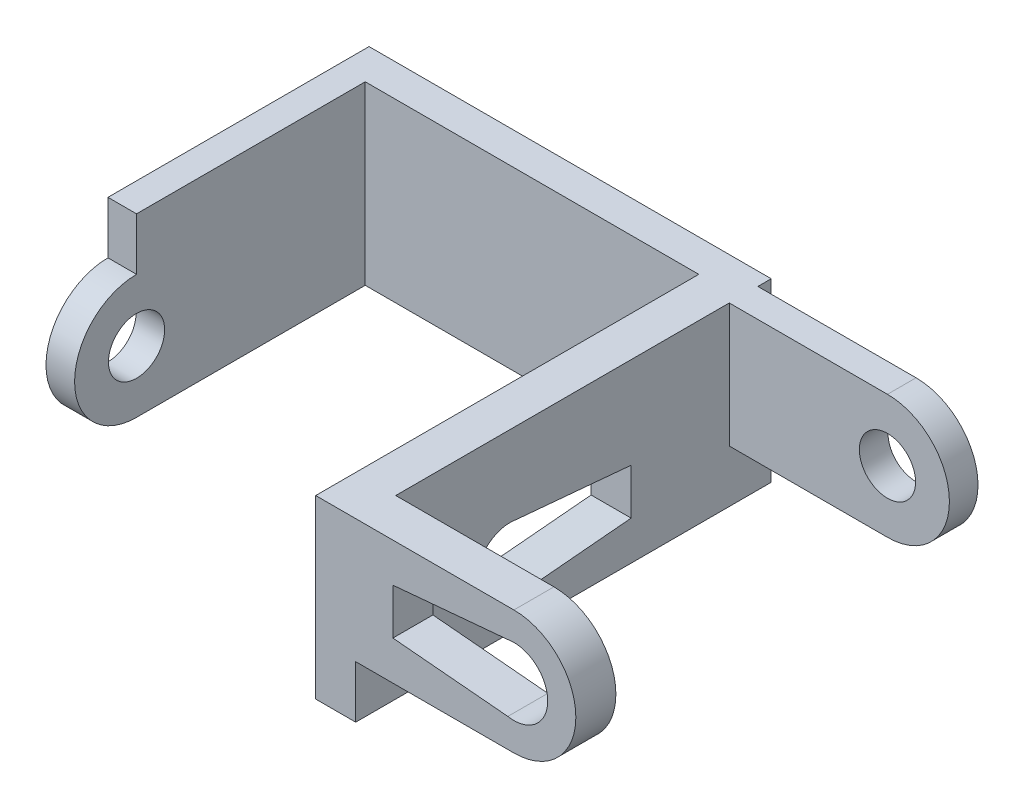
ISO-10303-21;
HEADER;
FILE_DESCRIPTION(('STEP AP214'),'2;1');
FILE_NAME('part.step','',(''),(''),'','','');
FILE_SCHEMA(('AUTOMOTIVE_DESIGN { 1 0 10303 214 1 1 1 1 }'));
ENDSEC;
DATA;
#1=APPLICATION_CONTEXT('core data for automotive mechanical design processes');
#2=APPLICATION_PROTOCOL_DEFINITION('international standard','automotive_design',2000,#1);
#3=PRODUCT_CONTEXT('',#1,'mechanical');
#4=PRODUCT('Part','Part','',(#3));
#5=PRODUCT_RELATED_PRODUCT_CATEGORY('part','',(#4));
#6=PRODUCT_DEFINITION_FORMATION('','',#4);
#7=PRODUCT_DEFINITION_CONTEXT('part definition',#1,'design');
#8=PRODUCT_DEFINITION('design','',#6,#7);
#9=PRODUCT_DEFINITION_SHAPE('','',#8);
#10=(LENGTH_UNIT() NAMED_UNIT(*) SI_UNIT(.MILLI.,.METRE.));
#11=(NAMED_UNIT(*) PLANE_ANGLE_UNIT() SI_UNIT($,.RADIAN.));
#12=(NAMED_UNIT(*) SI_UNIT($,.STERADIAN.) SOLID_ANGLE_UNIT());
#13=UNCERTAINTY_MEASURE_WITH_UNIT(LENGTH_MEASURE(1.E-05),#10,'distance_accuracy_value','');
#14=(GEOMETRIC_REPRESENTATION_CONTEXT(3) GLOBAL_UNCERTAINTY_ASSIGNED_CONTEXT((#13)) GLOBAL_UNIT_ASSIGNED_CONTEXT((#10,
#11,#12)) REPRESENTATION_CONTEXT('',''));
#15=CARTESIAN_POINT('',(0.,0.,0.));
#16=DIRECTION('',(0.,0.,1.));
#17=DIRECTION('',(1.,0.,0.));
#18=AXIS2_PLACEMENT_3D('',#15,#16,#17);
#19=CARTESIAN_POINT('',(-72.,-30.5,0.));
#20=DIRECTION('',(0.,0.,-1.));
#21=DIRECTION('',(-1.,0.,0.));
#22=AXIS2_PLACEMENT_3D('',#19,#20,#21);
#23=PLANE('',#22);
#24=DIRECTION('',(-1.,0.,0.));
#25=VECTOR('',#24,1.);
#26=CARTESIAN_POINT('',(-72.,-17.5,0.));
#27=LINE('',#26,#25);
#28=CARTESIAN_POINT('',(-72.,-17.5,0.));
#29=VERTEX_POINT('',#28);
#30=CARTESIAN_POINT('',(-75.,-17.5,0.));
#31=VERTEX_POINT('',#30);
#32=EDGE_CURVE('E11',#29,#31,#27,.T.);
#33=ORIENTED_EDGE('',*,*,#32,.F.);
#34=DIRECTION('',(0.,-1.,0.));
#35=VECTOR('',#34,1.);
#36=CARTESIAN_POINT('',(-72.,-30.5,0.));
#37=LINE('',#36,#35);
#38=CARTESIAN_POINT('',(-72.,-12.,0.));
#39=VERTEX_POINT('',#38);
#40=EDGE_CURVE('E239',#39,#29,#37,.T.);
#41=ORIENTED_EDGE('',*,*,#40,.F.);
#42=DIRECTION('',(-1.,0.,0.));
#43=VECTOR('',#42,1.);
#44=CARTESIAN_POINT('',(-72.,-12.,0.));
#45=LINE('',#44,#43);
#46=CARTESIAN_POINT('',(-75.,-12.,0.));
#47=VERTEX_POINT('',#46);
#48=EDGE_CURVE('E214',#39,#47,#45,.T.);
#49=ORIENTED_EDGE('',*,*,#48,.T.);
#50=DIRECTION('',(0.,-1.,0.));
#51=VECTOR('',#50,1.);
#52=CARTESIAN_POINT('',(-75.,-30.5,0.));
#53=LINE('',#52,#51);
#54=EDGE_CURVE('E58',#47,#31,#53,.T.);
#55=ORIENTED_EDGE('',*,*,#54,.T.);
#56=EDGE_LOOP('',(#33,#41,#49,#55));
#57=FACE_BOUND('',#56,.T.);
#58=ADVANCED_FACE('F39',(#57),#23,.F.);
#59=CARTESIAN_POINT('',(0.,0.,-24.));
#60=DIRECTION('',(0.,0.,-1.));
#61=DIRECTION('',(-1.,0.,0.));
#62=AXIS2_PLACEMENT_3D('',#59,#60,#61);
#63=PLANE('',#62);
#64=DIRECTION('',(0.,1.,0.));
#65=VECTOR('',#64,1.);
#66=CARTESIAN_POINT('',(-72.,0.,-24.));
#67=LINE('',#66,#65);
#68=CARTESIAN_POINT('',(-72.,-30.5,-24.));
#69=VERTEX_POINT('',#68);
#70=CARTESIAN_POINT('',(-72.,-12.,-24.));
#71=VERTEX_POINT('',#70);
#72=EDGE_CURVE('E48',#69,#71,#67,.T.);
#73=ORIENTED_EDGE('',*,*,#72,.F.);
#74=DIRECTION('',(1.,0.,0.));
#75=VECTOR('',#74,1.);
#76=CARTESIAN_POINT('',(-75.,-30.5,-24.));
#77=LINE('',#76,#75);
#78=CARTESIAN_POINT('',(-37.,-30.5,-24.));
#79=VERTEX_POINT('',#78);
#80=EDGE_CURVE('E251',#69,#79,#77,.T.);
#81=ORIENTED_EDGE('',*,*,#80,.T.);
#82=DIRECTION('',(0.,-1.,0.));
#83=VECTOR('',#82,1.);
#84=CARTESIAN_POINT('',(-37.,0.,-24.));
#85=LINE('',#84,#83);
#86=CARTESIAN_POINT('',(-37.,-12.,-24.));
#87=VERTEX_POINT('',#86);
#88=EDGE_CURVE('E468',#87,#79,#85,.T.);
#89=ORIENTED_EDGE('',*,*,#88,.F.);
#90=DIRECTION('',(-1.,0.,0.));
#91=VECTOR('',#90,1.);
#92=CARTESIAN_POINT('',(-75.,-12.,-24.));
#93=LINE('',#92,#91);
#94=EDGE_CURVE('E254',#87,#71,#93,.T.);
#95=ORIENTED_EDGE('',*,*,#94,.T.);
#96=EDGE_LOOP('',(#73,#81,#89,#95));
#97=FACE_BOUND('',#96,.T.);
#98=ADVANCED_FACE('F483',(#97),#63,.F.);
#99=CARTESIAN_POINT('',(-37.,0.,0.));
#100=DIRECTION('',(-1.,0.,0.));
#101=DIRECTION('',(0.,0.,1.));
#102=AXIS2_PLACEMENT_3D('',#99,#100,#101);
#103=PLANE('',#102);
#104=DIRECTION('',(0.,0.0899269689956985,0.995948362239352));
#105=VECTOR('',#104,1.);
#106=CARTESIAN_POINT('',(-37.,-20.45,0.));
#107=LINE('',#106,#105);
#108=CARTESIAN_POINT('',(-37.,-21.5967185946041,-12.7));
#109=VERTEX_POINT('',#108);
#110=CARTESIAN_POINT('',(-37.,-20.5074167042445,-0.635894584196137));
#111=VERTEX_POINT('',#110);
#112=EDGE_CURVE('E389',#109,#111,#107,.T.);
#113=ORIENTED_EDGE('',*,*,#112,.T.);
#114=CARTESIAN_POINT('',(-37.,-24.,0.));
#115=DIRECTION('',(1.,0.,0.));
#116=DIRECTION('',(0.,0.,-1.));
#117=AXIS2_PLACEMENT_3D('',#114,#115,#116);
#118=CIRCLE('',#117,3.55);
#119=CARTESIAN_POINT('',(-37.,-27.4925832957555,-0.635894584196137));
#120=VERTEX_POINT('',#119);
#121=EDGE_CURVE('E409',#111,#120,#118,.T.);
#122=ORIENTED_EDGE('',*,*,#121,.T.);
#123=DIRECTION('',(0.,0.0899269689956985,-0.995948362239352));
#124=VECTOR('',#123,1.);
#125=CARTESIAN_POINT('',(-37.,-26.4032814053959,-12.7));
#126=LINE('',#125,#124);
#127=CARTESIAN_POINT('',(-37.,-26.4032814053959,-12.7));
#128=VERTEX_POINT('',#127);
#129=EDGE_CURVE('E380',#120,#128,#126,.T.);
#130=ORIENTED_EDGE('',*,*,#129,.T.);
#131=DIRECTION('',(0.,1.,0.));
#132=VECTOR('',#131,1.);
#133=CARTESIAN_POINT('',(-37.,-21.5967185946041,-12.7));
#134=LINE('',#133,#132);
#135=EDGE_CURVE('E384',#128,#109,#134,.T.);
#136=ORIENTED_EDGE('',*,*,#135,.T.);
#137=EDGE_LOOP('',(#113,#122,#130,#136));
#138=FACE_BOUND('',#137,.T.);
#139=DIRECTION('',(0.,0.,1.));
#140=VECTOR('',#139,1.);
#141=CARTESIAN_POINT('',(-37.,-12.,16.2));
#142=LINE('',#141,#140);
#143=CARTESIAN_POINT('',(-37.,-12.,16.2));
#144=VERTEX_POINT('',#143);
#145=EDGE_CURVE('E419',#87,#144,#142,.T.);
#146=ORIENTED_EDGE('',*,*,#145,.F.);
#147=ORIENTED_EDGE('',*,*,#88,.T.);
#148=DIRECTION('',(0.,0.,-1.));
#149=VECTOR('',#148,1.);
#150=CARTESIAN_POINT('',(-37.,-30.5,16.2));
#151=LINE('',#150,#149);
#152=CARTESIAN_POINT('',(-37.,-30.5,16.2));
#153=VERTEX_POINT('',#152);
#154=EDGE_CURVE('E433',#153,#79,#151,.T.);
#155=ORIENTED_EDGE('',*,*,#154,.F.);
#156=DIRECTION('',(0.,-1.,0.));
#157=VECTOR('',#156,1.);
#158=CARTESIAN_POINT('',(-37.,-30.5,16.2));
#159=LINE('',#158,#157);
#160=EDGE_CURVE('E412',#144,#153,#159,.T.);
#161=ORIENTED_EDGE('',*,*,#160,.F.);
#162=EDGE_LOOP('',(#146,#147,#155,#161));
#163=FACE_BOUND('',#162,.T.);
#164=ADVANCED_FACE('F488',(#138,#163),#103,.T.);
#165=CARTESIAN_POINT('',(-32.8,0.,0.));
#166=DIRECTION('',(-1.,0.,0.));
#167=DIRECTION('',(0.,0.,1.));
#168=AXIS2_PLACEMENT_3D('',#165,#166,#167);
#169=PLANE('',#168);
#170=DIRECTION('',(0.,-1.,0.));
#171=VECTOR('',#170,1.);
#172=CARTESIAN_POINT('',(-32.8,0.,-26.));
#173=LINE('',#172,#171);
#174=CARTESIAN_POINT('',(-32.8,-12.,-26.));
#175=VERTEX_POINT('',#174);
#176=CARTESIAN_POINT('',(-32.8,-25.,-26.));
#177=VERTEX_POINT('',#176);
#178=EDGE_CURVE('E297',#175,#177,#173,.T.);
#179=ORIENTED_EDGE('',*,*,#178,.T.);
#180=DIRECTION('',(0.,0.,-1.));
#181=VECTOR('',#180,1.);
#182=CARTESIAN_POINT('',(-32.8,-25.,0.));
#183=LINE('',#182,#181);
#184=CARTESIAN_POINT('',(-32.8,-25.,-23.));
#185=VERTEX_POINT('',#184);
#186=EDGE_CURVE('E304',#185,#177,#183,.T.);
#187=ORIENTED_EDGE('',*,*,#186,.F.);
#188=DIRECTION('',(0.,-1.,0.));
#189=VECTOR('',#188,1.);
#190=CARTESIAN_POINT('',(-32.8,0.,-23.));
#191=LINE('',#190,#189);
#192=CARTESIAN_POINT('',(-32.8,-12.,-23.));
#193=VERTEX_POINT('',#192);
#194=EDGE_CURVE('E301',#193,#185,#191,.T.);
#195=ORIENTED_EDGE('',*,*,#194,.F.);
#196=DIRECTION('',(0.,0.,1.));
#197=VECTOR('',#196,1.);
#198=CARTESIAN_POINT('',(-32.8,-12.,16.2));
#199=LINE('',#198,#197);
#200=CARTESIAN_POINT('',(-32.8,-12.,12.));
#201=VERTEX_POINT('',#200);
#202=EDGE_CURVE('E425',#193,#201,#199,.T.);
#203=ORIENTED_EDGE('',*,*,#202,.T.);
#204=DIRECTION('',(0.,-1.,0.));
#205=VECTOR('',#204,1.);
#206=CARTESIAN_POINT('',(-32.8,0.,12.));
#207=LINE('',#206,#205);
#208=CARTESIAN_POINT('',(-32.8,-25.,12.));
#209=VERTEX_POINT('',#208);
#210=EDGE_CURVE('E371',#201,#209,#207,.T.);
#211=ORIENTED_EDGE('',*,*,#210,.T.);
#212=DIRECTION('',(0.,0.,-1.));
#213=VECTOR('',#212,1.);
#214=CARTESIAN_POINT('',(-32.8,-25.,0.));
#215=LINE('',#214,#213);
#216=CARTESIAN_POINT('',(-32.8,-25.,16.2));
#217=VERTEX_POINT('',#216);
#218=EDGE_CURVE('E375',#217,#209,#215,.T.);
#219=ORIENTED_EDGE('',*,*,#218,.F.);
#220=DIRECTION('',(0.,-1.,0.));
#221=VECTOR('',#220,1.);
#222=CARTESIAN_POINT('',(-32.8,-30.5,16.2));
#223=LINE('',#222,#221);
#224=CARTESIAN_POINT('',(-32.8,-30.5,16.2));
#225=VERTEX_POINT('',#224);
#226=EDGE_CURVE('E415',#217,#225,#223,.T.);
#227=ORIENTED_EDGE('',*,*,#226,.T.);
#228=DIRECTION('',(0.,0.,-1.));
#229=VECTOR('',#228,1.);
#230=CARTESIAN_POINT('',(-32.8,-30.5,16.2));
#231=LINE('',#230,#229);
#232=CARTESIAN_POINT('',(-32.8,-30.5,-27.4));
#233=VERTEX_POINT('',#232);
#234=EDGE_CURVE('E418',#225,#233,#231,.T.);
#235=ORIENTED_EDGE('',*,*,#234,.T.);
#236=DIRECTION('',(0.,1.,0.));
#237=VECTOR('',#236,1.);
#238=CARTESIAN_POINT('',(-32.8,-30.5,-27.4));
#239=LINE('',#238,#237);
#240=CARTESIAN_POINT('',(-32.8,-12.,-27.4));
#241=VERTEX_POINT('',#240);
#242=EDGE_CURVE('E422',#233,#241,#239,.T.);
#243=ORIENTED_EDGE('',*,*,#242,.T.);
#244=EDGE_CURVE('E426',#241,#175,#199,.T.);
#245=ORIENTED_EDGE('',*,*,#244,.T.);
#246=EDGE_LOOP('',(#179,#187,#195,#203,#211,#219,#227,#235,#243,#245));
#247=FACE_BOUND('',#246,.T.);
#248=CARTESIAN_POINT('',(-32.8,-24.,0.));
#249=DIRECTION('',(1.,0.,0.));
#250=DIRECTION('',(0.,0.,-1.));
#251=AXIS2_PLACEMENT_3D('',#248,#249,#250);
#252=CIRCLE('',#251,3.55);
#253=CARTESIAN_POINT('',(-32.8,-20.5074167042445,-0.635894584196137));
#254=VERTEX_POINT('',#253);
#255=CARTESIAN_POINT('',(-32.8,-27.4925832957555,-0.635894584196137));
#256=VERTEX_POINT('',#255);
#257=EDGE_CURVE('E405',#254,#256,#252,.T.);
#258=ORIENTED_EDGE('',*,*,#257,.F.);
#259=DIRECTION('',(0.,0.0899269689956985,0.995948362239352));
#260=VECTOR('',#259,1.);
#261=CARTESIAN_POINT('',(-32.8,-20.45,0.));
#262=LINE('',#261,#260);
#263=CARTESIAN_POINT('',(-32.8,-21.5967185946041,-12.7));
#264=VERTEX_POINT('',#263);
#265=EDGE_CURVE('E385',#264,#254,#262,.T.);
#266=ORIENTED_EDGE('',*,*,#265,.F.);
#267=DIRECTION('',(0.,1.,0.));
#268=VECTOR('',#267,1.);
#269=CARTESIAN_POINT('',(-32.8,-21.5967185946041,-12.7));
#270=LINE('',#269,#268);
#271=CARTESIAN_POINT('',(-32.8,-26.4032814053959,-12.7));
#272=VERTEX_POINT('',#271);
#273=EDGE_CURVE('E396',#272,#264,#270,.T.);
#274=ORIENTED_EDGE('',*,*,#273,.F.);
#275=DIRECTION('',(0.,0.0899269689956985,-0.995948362239352));
#276=VECTOR('',#275,1.);
#277=CARTESIAN_POINT('',(-32.8,-26.4032814053959,-12.7));
#278=LINE('',#277,#276);
#279=EDGE_CURVE('E379',#256,#272,#278,.T.);
#280=ORIENTED_EDGE('',*,*,#279,.F.);
#281=EDGE_LOOP('',(#258,#266,#274,#280));
#282=FACE_BOUND('',#281,.T.);
#283=ADVANCED_FACE('F560',(#247,#282),#169,.F.);
#284=CARTESIAN_POINT('',(-32.8,-30.5,16.2));
#285=DIRECTION('',(0.,0.,-1.));
#286=DIRECTION('',(-1.,0.,0.));
#287=AXIS2_PLACEMENT_3D('',#284,#285,#286);
#288=PLANE('',#287);
#289=CARTESIAN_POINT('',(-16.2,-18.5,16.2));
#290=DIRECTION('',(0.,0.,1.));
#291=DIRECTION('',(1.,0.,0.));
#292=AXIS2_PLACEMENT_3D('',#289,#290,#291);
#293=CIRCLE('',#292,3.55);
#294=CARTESIAN_POINT('',(-16.8358945841961,-21.9925832957555,16.2));
#295=VERTEX_POINT('',#294);
#296=CARTESIAN_POINT('',(-16.8358945841962,-15.0074167042445,16.2));
#297=VERTEX_POINT('',#296);
#298=EDGE_CURVE('E334',#295,#297,#293,.T.);
#299=ORIENTED_EDGE('',*,*,#298,.F.);
#300=DIRECTION('',(0.995948362239352,-0.0899269689956985,0.));
#301=VECTOR('',#300,1.);
#302=CARTESIAN_POINT('',(-16.2,-22.05,16.2));
#303=LINE('',#302,#301);
#304=CARTESIAN_POINT('',(-28.9,-20.9032814053959,16.2));
#305=VERTEX_POINT('',#304);
#306=EDGE_CURVE('E313',#305,#295,#303,.T.);
#307=ORIENTED_EDGE('',*,*,#306,.F.);
#308=DIRECTION('',(0.,-1.,0.));
#309=VECTOR('',#308,1.);
#310=CARTESIAN_POINT('',(-28.9,-20.9032814053959,16.2));
#311=LINE('',#310,#309);
#312=CARTESIAN_POINT('',(-28.9,-16.0967185946041,16.2));
#313=VERTEX_POINT('',#312);
#314=EDGE_CURVE('E324',#313,#305,#311,.T.);
#315=ORIENTED_EDGE('',*,*,#314,.F.);
#316=DIRECTION('',(-0.995948362239352,-0.0899269689956984,0.));
#317=VECTOR('',#316,1.);
#318=CARTESIAN_POINT('',(-28.9,-16.0967185946041,16.2));
#319=LINE('',#318,#317);
#320=EDGE_CURVE('E307',#297,#313,#319,.T.);
#321=ORIENTED_EDGE('',*,*,#320,.F.);
#322=EDGE_LOOP('',(#299,#307,#315,#321));
#323=FACE_BOUND('',#322,.T.);
#324=DIRECTION('',(1.,0.,0.));
#325=VECTOR('',#324,1.);
#326=CARTESIAN_POINT('',(-37.,-25.,16.2));
#327=LINE('',#326,#325);
#328=CARTESIAN_POINT('',(-16.2,-25.,16.2));
#329=VERTEX_POINT('',#328);
#330=EDGE_CURVE('E354',#217,#329,#327,.T.);
#331=ORIENTED_EDGE('',*,*,#330,.T.);
#332=CARTESIAN_POINT('',(-16.2,-18.5,16.2));
#333=DIRECTION('',(0.,0.,1.));
#334=DIRECTION('',(1.,0.,0.));
#335=AXIS2_PLACEMENT_3D('',#332,#333,#334);
#336=CIRCLE('',#335,6.5);
#337=CARTESIAN_POINT('',(-16.2,-12.,16.2));
#338=VERTEX_POINT('',#337);
#339=EDGE_CURVE('E346',#329,#338,#336,.T.);
#340=ORIENTED_EDGE('',*,*,#339,.T.);
#341=DIRECTION('',(-1.,0.,0.));
#342=VECTOR('',#341,1.);
#343=CARTESIAN_POINT('',(-32.8,-12.,16.2));
#344=LINE('',#343,#342);
#345=EDGE_CURVE('E430',#338,#144,#344,.T.);
#346=ORIENTED_EDGE('',*,*,#345,.T.);
#347=ORIENTED_EDGE('',*,*,#160,.T.);
#348=DIRECTION('',(-1.,0.,0.));
#349=VECTOR('',#348,1.);
#350=CARTESIAN_POINT('',(-32.8,-30.5,16.2));
#351=LINE('',#350,#349);
#352=EDGE_CURVE('E448',#225,#153,#351,.T.);
#353=ORIENTED_EDGE('',*,*,#352,.F.);
#354=ORIENTED_EDGE('',*,*,#226,.F.);
#355=EDGE_LOOP('',(#331,#340,#346,#347,#353,#354));
#356=FACE_BOUND('',#355,.T.);
#357=ADVANCED_FACE('F41',(#323,#356),#288,.F.);
#358=CARTESIAN_POINT('',(-32.8,-30.5,16.2));
#359=DIRECTION('',(0.,1.,0.));
#360=DIRECTION('',(0.,0.,1.));
#361=AXIS2_PLACEMENT_3D('',#358,#359,#360);
#362=PLANE('',#361);
#363=DIRECTION('',(0.,0.,-1.));
#364=VECTOR('',#363,1.);
#365=CARTESIAN_POINT('',(-75.,-30.5,-24.));
#366=LINE('',#365,#364);
#367=CARTESIAN_POINT('',(-75.,-30.5,0.));
#368=VERTEX_POINT('',#367);
#369=CARTESIAN_POINT('',(-75.,-30.5,-27.4));
#370=VERTEX_POINT('',#369);
#371=EDGE_CURVE('E203',#368,#370,#366,.T.);
#372=ORIENTED_EDGE('',*,*,#371,.T.);
#373=DIRECTION('',(-1.,0.,0.));
#374=VECTOR('',#373,1.);
#375=CARTESIAN_POINT('',(-32.8,-30.5,-27.4));
#376=LINE('',#375,#374);
#377=EDGE_CURVE('E445',#233,#370,#376,.T.);
#378=ORIENTED_EDGE('',*,*,#377,.F.);
#379=ORIENTED_EDGE('',*,*,#234,.F.);
#380=ORIENTED_EDGE('',*,*,#352,.T.);
#381=ORIENTED_EDGE('',*,*,#154,.T.);
#382=ORIENTED_EDGE('',*,*,#80,.F.);
#383=DIRECTION('',(0.,0.,-1.));
#384=VECTOR('',#383,1.);
#385=CARTESIAN_POINT('',(-72.,-30.5,0.));
#386=LINE('',#385,#384);
#387=CARTESIAN_POINT('',(-72.,-30.5,0.));
#388=VERTEX_POINT('',#387);
#389=EDGE_CURVE('E207',#388,#69,#386,.T.);
#390=ORIENTED_EDGE('',*,*,#389,.F.);
#391=DIRECTION('',(-1.,0.,0.));
#392=VECTOR('',#391,1.);
#393=CARTESIAN_POINT('',(-72.,-30.5,0.));
#394=LINE('',#393,#392);
#395=EDGE_CURVE('E199',#388,#368,#394,.T.);
#396=ORIENTED_EDGE('',*,*,#395,.T.);
#397=EDGE_LOOP('',(#372,#378,#379,#380,#381,#382,#390,#396));
#398=FACE_BOUND('',#397,.T.);
#399=ADVANCED_FACE('F201',(#398),#362,.F.);
#400=CARTESIAN_POINT('',(-32.8,-30.5,-27.4));
#401=DIRECTION('',(0.,0.,1.));
#402=DIRECTION('',(1.,0.,0.));
#403=AXIS2_PLACEMENT_3D('',#400,#401,#402);
#404=PLANE('',#403);
#405=DIRECTION('',(0.,-1.,0.));
#406=VECTOR('',#405,1.);
#407=CARTESIAN_POINT('',(-75.,-30.5,-27.4));
#408=LINE('',#407,#406);
#409=CARTESIAN_POINT('',(-75.,-12.,-27.4));
#410=VERTEX_POINT('',#409);
#411=EDGE_CURVE('E213',#410,#370,#408,.T.);
#412=ORIENTED_EDGE('',*,*,#411,.F.);
#413=DIRECTION('',(-1.,0.,0.));
#414=VECTOR('',#413,1.);
#415=CARTESIAN_POINT('',(-32.8,-12.,-27.4));
#416=LINE('',#415,#414);
#417=EDGE_CURVE('E442',#241,#410,#416,.T.);
#418=ORIENTED_EDGE('',*,*,#417,.F.);
#419=ORIENTED_EDGE('',*,*,#242,.F.);
#420=ORIENTED_EDGE('',*,*,#377,.T.);
#421=EDGE_LOOP('',(#412,#418,#419,#420));
#422=FACE_BOUND('',#421,.T.);
#423=ADVANCED_FACE('F569',(#422),#404,.F.);
#424=CARTESIAN_POINT('',(-32.8,-12.,16.2));
#425=DIRECTION('',(0.,-1.,0.));
#426=DIRECTION('',(0.,0.,-1.));
#427=AXIS2_PLACEMENT_3D('',#424,#425,#426);
#428=PLANE('',#427);
#429=DIRECTION('',(0.,0.,-1.));
#430=VECTOR('',#429,1.);
#431=CARTESIAN_POINT('',(-75.,-12.,-24.));
#432=LINE('',#431,#430);
#433=EDGE_CURVE('E224',#47,#410,#432,.T.);
#434=ORIENTED_EDGE('',*,*,#433,.F.);
#435=ORIENTED_EDGE('',*,*,#48,.F.);
#436=DIRECTION('',(0.,0.,1.));
#437=VECTOR('',#436,1.);
#438=CARTESIAN_POINT('',(-72.,-12.,0.));
#439=LINE('',#438,#437);
#440=EDGE_CURVE('E244',#71,#39,#439,.T.);
#441=ORIENTED_EDGE('',*,*,#440,.F.);
#442=ORIENTED_EDGE('',*,*,#94,.F.);
#443=ORIENTED_EDGE('',*,*,#145,.T.);
#444=ORIENTED_EDGE('',*,*,#345,.F.);
#445=DIRECTION('',(0.,0.,-1.));
#446=VECTOR('',#445,1.);
#447=CARTESIAN_POINT('',(-16.2,-12.,16.2));
#448=LINE('',#447,#446);
#449=CARTESIAN_POINT('',(-16.2,-12.,12.));
#450=VERTEX_POINT('',#449);
#451=EDGE_CURVE('E357',#338,#450,#448,.T.);
#452=ORIENTED_EDGE('',*,*,#451,.T.);
#453=DIRECTION('',(-1.,0.,0.));
#454=VECTOR('',#453,1.);
#455=CARTESIAN_POINT('',(-37.,-12.,12.));
#456=LINE('',#455,#454);
#457=EDGE_CURVE('E358',#450,#201,#456,.T.);
#458=ORIENTED_EDGE('',*,*,#457,.T.);
#459=ORIENTED_EDGE('',*,*,#202,.F.);
#460=DIRECTION('',(-1.,0.,0.));
#461=VECTOR('',#460,1.);
#462=CARTESIAN_POINT('',(-37.,-12.,-23.));
#463=LINE('',#462,#461);
#464=CARTESIAN_POINT('',(-16.2,-12.,-23.));
#465=VERTEX_POINT('',#464);
#466=EDGE_CURVE('E280',#465,#193,#463,.T.);
#467=ORIENTED_EDGE('',*,*,#466,.F.);
#468=DIRECTION('',(0.,0.,-1.));
#469=VECTOR('',#468,1.);
#470=CARTESIAN_POINT('',(-16.2,-12.,-23.));
#471=LINE('',#470,#469);
#472=CARTESIAN_POINT('',(-16.2,-12.,-26.));
#473=VERTEX_POINT('',#472);
#474=EDGE_CURVE('E284',#465,#473,#471,.T.);
#475=ORIENTED_EDGE('',*,*,#474,.T.);
#476=DIRECTION('',(-1.,0.,0.));
#477=VECTOR('',#476,1.);
#478=CARTESIAN_POINT('',(-37.,-12.,-26.));
#479=LINE('',#478,#477);
#480=EDGE_CURVE('E281',#473,#175,#479,.T.);
#481=ORIENTED_EDGE('',*,*,#480,.T.);
#482=ORIENTED_EDGE('',*,*,#244,.F.);
#483=ORIENTED_EDGE('',*,*,#417,.T.);
#484=EDGE_LOOP('',(#434,#435,#441,#442,#443,#444,#452,#458,#459,#467,#475,#481,#482,#483));
#485=FACE_BOUND('',#484,.T.);
#486=ADVANCED_FACE('F480',(#485),#428,.F.);
#487=CARTESIAN_POINT('',(-37.,-24.,0.));
#488=DIRECTION('',(1.,0.,0.));
#489=DIRECTION('',(0.,0.,-1.));
#490=AXIS2_PLACEMENT_3D('',#487,#488,#489);
#491=CYLINDRICAL_SURFACE('',#490,3.55);
#492=ORIENTED_EDGE('',*,*,#257,.T.);
#493=DIRECTION('',(1.,0.,0.));
#494=VECTOR('',#493,1.);
#495=CARTESIAN_POINT('',(-37.,-27.4925832957555,-0.635894584196137));
#496=LINE('',#495,#494);
#497=EDGE_CURVE('E452',#256,#120,#496,.F.);
#498=ORIENTED_EDGE('',*,*,#497,.T.);
#499=ORIENTED_EDGE('',*,*,#121,.F.);
#500=DIRECTION('',(1.,0.,0.));
#501=VECTOR('',#500,1.);
#502=CARTESIAN_POINT('',(-37.,-20.5074167042445,-0.635894584196137));
#503=LINE('',#502,#501);
#504=EDGE_CURVE('E456',#111,#254,#503,.T.);
#505=ORIENTED_EDGE('',*,*,#504,.T.);
#506=EDGE_LOOP('',(#492,#498,#499,#505));
#507=FACE_BOUND('',#506,.T.);
#508=ADVANCED_FACE('F549',(#507),#491,.F.);
#509=CARTESIAN_POINT('',(-37.,-20.45,0.));
#510=DIRECTION('',(0.,0.995948362239351,-0.0899269689956985));
#511=DIRECTION('',(0.,0.0899269689956985,0.995948362239352));
#512=AXIS2_PLACEMENT_3D('',#509,#510,#511);
#513=PLANE('',#512);
#514=ORIENTED_EDGE('',*,*,#112,.F.);
#515=DIRECTION('',(1.,0.,0.));
#516=VECTOR('',#515,1.);
#517=CARTESIAN_POINT('',(-37.,-21.5967185946041,-12.7));
#518=LINE('',#517,#516);
#519=EDGE_CURVE('E402',#109,#264,#518,.T.);
#520=ORIENTED_EDGE('',*,*,#519,.T.);
#521=ORIENTED_EDGE('',*,*,#265,.T.);
#522=ORIENTED_EDGE('',*,*,#504,.F.);
#523=EDGE_LOOP('',(#514,#520,#521,#522));
#524=FACE_BOUND('',#523,.T.);
#525=ADVANCED_FACE('F545',(#524),#513,.F.);
#526=CARTESIAN_POINT('',(-37.,-26.4032814053959,-12.7));
#527=DIRECTION('',(0.,-0.995948362239351,-0.0899269689956985));
#528=DIRECTION('',(0.,0.0899269689956985,-0.995948362239352));
#529=AXIS2_PLACEMENT_3D('',#526,#527,#528);
#530=PLANE('',#529);
#531=ORIENTED_EDGE('',*,*,#279,.T.);
#532=DIRECTION('',(1.,0.,0.));
#533=VECTOR('',#532,1.);
#534=CARTESIAN_POINT('',(-37.,-26.4032814053959,-12.7));
#535=LINE('',#534,#533);
#536=EDGE_CURVE('E393',#128,#272,#535,.T.);
#537=ORIENTED_EDGE('',*,*,#536,.F.);
#538=ORIENTED_EDGE('',*,*,#129,.F.);
#539=ORIENTED_EDGE('',*,*,#497,.F.);
#540=EDGE_LOOP('',(#531,#537,#538,#539));
#541=FACE_BOUND('',#540,.T.);
#542=ADVANCED_FACE('F548',(#541),#530,.F.);
#543=CARTESIAN_POINT('',(-37.,-21.5967185946041,-12.7));
#544=DIRECTION('',(0.,0.,-1.));
#545=DIRECTION('',(-1.,0.,0.));
#546=AXIS2_PLACEMENT_3D('',#543,#544,#545);
#547=PLANE('',#546);
#548=ORIENTED_EDGE('',*,*,#273,.T.);
#549=ORIENTED_EDGE('',*,*,#519,.F.);
#550=ORIENTED_EDGE('',*,*,#135,.F.);
#551=ORIENTED_EDGE('',*,*,#536,.T.);
#552=EDGE_LOOP('',(#548,#549,#550,#551));
#553=FACE_BOUND('',#552,.T.);
#554=ADVANCED_FACE('F543',(#553),#547,.F.);
#555=CARTESIAN_POINT('',(-37.,-25.,16.2));
#556=DIRECTION('',(0.,1.,0.));
#557=DIRECTION('',(0.,0.,1.));
#558=AXIS2_PLACEMENT_3D('',#555,#556,#557);
#559=PLANE('',#558);
#560=ORIENTED_EDGE('',*,*,#330,.F.);
#561=ORIENTED_EDGE('',*,*,#218,.T.);
#562=DIRECTION('',(1.,0.,0.));
#563=VECTOR('',#562,1.);
#564=CARTESIAN_POINT('',(-37.,-25.,12.));
#565=LINE('',#564,#563);
#566=CARTESIAN_POINT('',(-16.2,-25.,12.));
#567=VERTEX_POINT('',#566);
#568=EDGE_CURVE('E350',#209,#567,#565,.T.);
#569=ORIENTED_EDGE('',*,*,#568,.T.);
#570=DIRECTION('',(0.,0.,-1.));
#571=VECTOR('',#570,1.);
#572=CARTESIAN_POINT('',(-16.2,-25.,16.2));
#573=LINE('',#572,#571);
#574=EDGE_CURVE('E367',#329,#567,#573,.T.);
#575=ORIENTED_EDGE('',*,*,#574,.F.);
#576=EDGE_LOOP('',(#560,#561,#569,#575));
#577=FACE_BOUND('',#576,.T.);
#578=ADVANCED_FACE('F539',(#577),#559,.F.);
#579=CARTESIAN_POINT('',(0.,0.,12.));
#580=DIRECTION('',(0.,0.,-1.));
#581=DIRECTION('',(-1.,0.,0.));
#582=AXIS2_PLACEMENT_3D('',#579,#580,#581);
#583=PLANE('',#582);
#584=DIRECTION('',(0.995948362239352,-0.0899269689956985,0.));
#585=VECTOR('',#584,1.);
#586=CARTESIAN_POINT('',(-16.2,-22.05,12.));
#587=LINE('',#586,#585);
#588=CARTESIAN_POINT('',(-28.9,-20.9032814053959,12.));
#589=VERTEX_POINT('',#588);
#590=CARTESIAN_POINT('',(-16.8358945841961,-21.9925832957555,12.));
#591=VERTEX_POINT('',#590);
#592=EDGE_CURVE('E317',#589,#591,#587,.T.);
#593=ORIENTED_EDGE('',*,*,#592,.T.);
#594=CARTESIAN_POINT('',(-16.2,-18.5,12.));
#595=DIRECTION('',(0.,0.,1.));
#596=DIRECTION('',(1.,0.,0.));
#597=AXIS2_PLACEMENT_3D('',#594,#595,#596);
#598=CIRCLE('',#597,3.55);
#599=CARTESIAN_POINT('',(-16.8358945841962,-15.0074167042445,12.));
#600=VERTEX_POINT('',#599);
#601=EDGE_CURVE('E338',#591,#600,#598,.T.);
#602=ORIENTED_EDGE('',*,*,#601,.T.);
#603=DIRECTION('',(-0.995948362239352,-0.0899269689956984,0.));
#604=VECTOR('',#603,1.);
#605=CARTESIAN_POINT('',(-28.9,-16.0967185946041,12.));
#606=LINE('',#605,#604);
#607=CARTESIAN_POINT('',(-28.9,-16.0967185946041,12.));
#608=VERTEX_POINT('',#607);
#609=EDGE_CURVE('E308',#600,#608,#606,.T.);
#610=ORIENTED_EDGE('',*,*,#609,.T.);
#611=DIRECTION('',(0.,-1.,0.));
#612=VECTOR('',#611,1.);
#613=CARTESIAN_POINT('',(-28.9,-20.9032814053959,12.));
#614=LINE('',#613,#612);
#615=EDGE_CURVE('E312',#608,#589,#614,.T.);
#616=ORIENTED_EDGE('',*,*,#615,.T.);
#617=EDGE_LOOP('',(#593,#602,#610,#616));
#618=FACE_BOUND('',#617,.T.);
#619=ORIENTED_EDGE('',*,*,#457,.F.);
#620=CARTESIAN_POINT('',(-16.2,-18.5,12.));
#621=DIRECTION('',(0.,0.,1.));
#622=DIRECTION('',(1.,0.,0.));
#623=AXIS2_PLACEMENT_3D('',#620,#621,#622);
#624=CIRCLE('',#623,6.5);
#625=EDGE_CURVE('E342',#567,#450,#624,.T.);
#626=ORIENTED_EDGE('',*,*,#625,.F.);
#627=ORIENTED_EDGE('',*,*,#568,.F.);
#628=ORIENTED_EDGE('',*,*,#210,.F.);
#629=EDGE_LOOP('',(#619,#626,#627,#628));
#630=FACE_BOUND('',#629,.T.);
#631=ADVANCED_FACE('F535',(#618,#630),#583,.T.);
#632=CARTESIAN_POINT('',(-16.2,-18.5,16.2));
#633=DIRECTION('',(0.,0.,-1.));
#634=DIRECTION('',(-1.,0.,0.));
#635=AXIS2_PLACEMENT_3D('',#632,#633,#634);
#636=CYLINDRICAL_SURFACE('',#635,6.5);
#637=ORIENTED_EDGE('',*,*,#625,.T.);
#638=ORIENTED_EDGE('',*,*,#451,.F.);
#639=ORIENTED_EDGE('',*,*,#339,.F.);
#640=ORIENTED_EDGE('',*,*,#574,.T.);
#641=EDGE_LOOP('',(#637,#638,#639,#640));
#642=FACE_BOUND('',#641,.T.);
#643=ADVANCED_FACE('F531',(#642),#636,.T.);
#644=CARTESIAN_POINT('',(-16.2,-18.5,12.));
#645=DIRECTION('',(0.,0.,1.));
#646=DIRECTION('',(1.,0.,0.));
#647=AXIS2_PLACEMENT_3D('',#644,#645,#646);
#648=CYLINDRICAL_SURFACE('',#647,3.55);
#649=ORIENTED_EDGE('',*,*,#298,.T.);
#650=DIRECTION('',(0.,0.,1.));
#651=VECTOR('',#650,1.);
#652=CARTESIAN_POINT('',(-16.8358945841962,-15.0074167042446,12.));
#653=LINE('',#652,#651);
#654=EDGE_CURVE('E460',#297,#600,#653,.F.);
#655=ORIENTED_EDGE('',*,*,#654,.T.);
#656=ORIENTED_EDGE('',*,*,#601,.F.);
#657=DIRECTION('',(0.,0.,1.));
#658=VECTOR('',#657,1.);
#659=CARTESIAN_POINT('',(-16.8358945841961,-21.9925832957555,12.));
#660=LINE('',#659,#658);
#661=EDGE_CURVE('E464',#591,#295,#660,.T.);
#662=ORIENTED_EDGE('',*,*,#661,.T.);
#663=EDGE_LOOP('',(#649,#655,#656,#662));
#664=FACE_BOUND('',#663,.T.);
#665=ADVANCED_FACE('F521',(#664),#648,.F.);
#666=CARTESIAN_POINT('',(-16.2,-22.05,12.));
#667=DIRECTION('',(-0.0899269689956985,-0.995948362239351,0.));
#668=DIRECTION('',(0.995948362239352,-0.0899269689956985,0.));
#669=AXIS2_PLACEMENT_3D('',#666,#667,#668);
#670=PLANE('',#669);
#671=ORIENTED_EDGE('',*,*,#592,.F.);
#672=DIRECTION('',(0.,0.,1.));
#673=VECTOR('',#672,1.);
#674=CARTESIAN_POINT('',(-28.9,-20.9032814053959,12.));
#675=LINE('',#674,#673);
#676=EDGE_CURVE('E331',#589,#305,#675,.T.);
#677=ORIENTED_EDGE('',*,*,#676,.T.);
#678=ORIENTED_EDGE('',*,*,#306,.T.);
#679=ORIENTED_EDGE('',*,*,#661,.F.);
#680=EDGE_LOOP('',(#671,#677,#678,#679));
#681=FACE_BOUND('',#680,.T.);
#682=ADVANCED_FACE('F517',(#681),#670,.F.);
#683=CARTESIAN_POINT('',(-28.9,-16.0967185946041,12.));
#684=DIRECTION('',(-0.0899269689956984,0.995948362239351,0.));
#685=DIRECTION('',(-0.995948362239352,-0.0899269689956984,0.));
#686=AXIS2_PLACEMENT_3D('',#683,#684,#685);
#687=PLANE('',#686);
#688=ORIENTED_EDGE('',*,*,#320,.T.);
#689=DIRECTION('',(0.,0.,1.));
#690=VECTOR('',#689,1.);
#691=CARTESIAN_POINT('',(-28.9,-16.0967185946041,12.));
#692=LINE('',#691,#690);
#693=EDGE_CURVE('E321',#608,#313,#692,.T.);
#694=ORIENTED_EDGE('',*,*,#693,.F.);
#695=ORIENTED_EDGE('',*,*,#609,.F.);
#696=ORIENTED_EDGE('',*,*,#654,.F.);
#697=EDGE_LOOP('',(#688,#694,#695,#696));
#698=FACE_BOUND('',#697,.T.);
#699=ADVANCED_FACE('F520',(#698),#687,.F.);
#700=CARTESIAN_POINT('',(-28.9,-20.9032814053959,12.));
#701=DIRECTION('',(-1.,0.,0.));
#702=DIRECTION('',(0.,0.,1.));
#703=AXIS2_PLACEMENT_3D('',#700,#701,#702);
#704=PLANE('',#703);
#705=ORIENTED_EDGE('',*,*,#314,.T.);
#706=ORIENTED_EDGE('',*,*,#676,.F.);
#707=ORIENTED_EDGE('',*,*,#615,.F.);
#708=ORIENTED_EDGE('',*,*,#693,.T.);
#709=EDGE_LOOP('',(#705,#706,#707,#708));
#710=FACE_BOUND('',#709,.T.);
#711=ADVANCED_FACE('F515',(#710),#704,.F.);
#712=CARTESIAN_POINT('',(-37.,-25.,-23.));
#713=DIRECTION('',(0.,1.,0.));
#714=DIRECTION('',(0.,0.,1.));
#715=AXIS2_PLACEMENT_3D('',#712,#713,#714);
#716=PLANE('',#715);
#717=DIRECTION('',(1.,0.,0.));
#718=VECTOR('',#717,1.);
#719=CARTESIAN_POINT('',(-37.,-25.,-23.));
#720=LINE('',#719,#718);
#721=CARTESIAN_POINT('',(-16.2,-25.,-23.));
#722=VERTEX_POINT('',#721);
#723=EDGE_CURVE('E277',#185,#722,#720,.T.);
#724=ORIENTED_EDGE('',*,*,#723,.F.);
#725=ORIENTED_EDGE('',*,*,#186,.T.);
#726=DIRECTION('',(1.,0.,0.));
#727=VECTOR('',#726,1.);
#728=CARTESIAN_POINT('',(-37.,-25.,-26.));
#729=LINE('',#728,#727);
#730=CARTESIAN_POINT('',(-16.2,-25.,-26.));
#731=VERTEX_POINT('',#730);
#732=EDGE_CURVE('E273',#177,#731,#729,.T.);
#733=ORIENTED_EDGE('',*,*,#732,.T.);
#734=DIRECTION('',(0.,0.,-1.));
#735=VECTOR('',#734,1.);
#736=CARTESIAN_POINT('',(-16.2,-25.,-23.));
#737=LINE('',#736,#735);
#738=EDGE_CURVE('E293',#722,#731,#737,.T.);
#739=ORIENTED_EDGE('',*,*,#738,.F.);
#740=EDGE_LOOP('',(#724,#725,#733,#739));
#741=FACE_BOUND('',#740,.T.);
#742=ADVANCED_FACE('F508',(#741),#716,.F.);
#743=CARTESIAN_POINT('',(0.,0.,-23.));
#744=DIRECTION('',(0.,0.,-1.));
#745=DIRECTION('',(-1.,0.,0.));
#746=AXIS2_PLACEMENT_3D('',#743,#744,#745);
#747=PLANE('',#746);
#748=CARTESIAN_POINT('',(-16.2,-18.5,-23.));
#749=DIRECTION('',(0.,0.,1.));
#750=DIRECTION('',(1.,0.,0.));
#751=AXIS2_PLACEMENT_3D('',#748,#749,#750);
#752=CIRCLE('',#751,2.95);
#753=CARTESIAN_POINT('',(-13.25,-18.5,-23.));
#754=VERTEX_POINT('',#753);
#755=EDGE_CURVE('E223',#754,#754,#752,.T.);
#756=ORIENTED_EDGE('',*,*,#755,.F.);
#757=EDGE_LOOP('',(#756));
#758=FACE_BOUND('',#757,.T.);
#759=ORIENTED_EDGE('',*,*,#723,.T.);
#760=CARTESIAN_POINT('',(-16.2,-18.5,-23.));
#761=DIRECTION('',(0.,0.,1.));
#762=DIRECTION('',(1.,0.,0.));
#763=AXIS2_PLACEMENT_3D('',#760,#761,#762);
#764=CIRCLE('',#763,6.5);
#765=EDGE_CURVE('E269',#722,#465,#764,.T.);
#766=ORIENTED_EDGE('',*,*,#765,.T.);
#767=ORIENTED_EDGE('',*,*,#466,.T.);
#768=ORIENTED_EDGE('',*,*,#194,.T.);
#769=EDGE_LOOP('',(#759,#766,#767,#768));
#770=FACE_BOUND('',#769,.T.);
#771=ADVANCED_FACE('F505',(#758,#770),#747,.F.);
#772=CARTESIAN_POINT('',(0.,0.,-26.));
#773=DIRECTION('',(0.,0.,-1.));
#774=DIRECTION('',(-1.,0.,0.));
#775=AXIS2_PLACEMENT_3D('',#772,#773,#774);
#776=PLANE('',#775);
#777=CARTESIAN_POINT('',(-16.2,-18.5,-26.));
#778=DIRECTION('',(0.,0.,1.));
#779=DIRECTION('',(1.,0.,0.));
#780=AXIS2_PLACEMENT_3D('',#777,#778,#779);
#781=CIRCLE('',#780,2.95);
#782=CARTESIAN_POINT('',(-13.25,-18.5,-26.));
#783=VERTEX_POINT('',#782);
#784=EDGE_CURVE('E261',#783,#783,#781,.T.);
#785=ORIENTED_EDGE('',*,*,#784,.T.);
#786=EDGE_LOOP('',(#785));
#787=FACE_BOUND('',#786,.T.);
#788=ORIENTED_EDGE('',*,*,#480,.F.);
#789=CARTESIAN_POINT('',(-16.2,-18.5,-26.));
#790=DIRECTION('',(0.,0.,1.));
#791=DIRECTION('',(1.,0.,0.));
#792=AXIS2_PLACEMENT_3D('',#789,#790,#791);
#793=CIRCLE('',#792,6.5);
#794=EDGE_CURVE('E265',#731,#473,#793,.T.);
#795=ORIENTED_EDGE('',*,*,#794,.F.);
#796=ORIENTED_EDGE('',*,*,#732,.F.);
#797=ORIENTED_EDGE('',*,*,#178,.F.);
#798=EDGE_LOOP('',(#788,#795,#796,#797));
#799=FACE_BOUND('',#798,.T.);
#800=ADVANCED_FACE('F503',(#787,#799),#776,.T.);
#801=CARTESIAN_POINT('',(-16.2,-18.5,-23.));
#802=DIRECTION('',(0.,0.,-1.));
#803=DIRECTION('',(-1.,0.,0.));
#804=AXIS2_PLACEMENT_3D('',#801,#802,#803);
#805=CYLINDRICAL_SURFACE('',#804,6.5);
#806=ORIENTED_EDGE('',*,*,#794,.T.);
#807=ORIENTED_EDGE('',*,*,#474,.F.);
#808=ORIENTED_EDGE('',*,*,#765,.F.);
#809=ORIENTED_EDGE('',*,*,#738,.T.);
#810=EDGE_LOOP('',(#806,#807,#808,#809));
#811=FACE_BOUND('',#810,.T.);
#812=ADVANCED_FACE('F499',(#811),#805,.T.);
#813=CARTESIAN_POINT('',(-16.2,-18.5,-26.));
#814=DIRECTION('',(0.,0.,1.));
#815=DIRECTION('',(1.,0.,0.));
#816=AXIS2_PLACEMENT_3D('',#813,#814,#815);
#817=CYLINDRICAL_SURFACE('',#816,2.95);
#818=CARTESIAN_POINT('',(-13.25,-18.5,-26.));
#819=CARTESIAN_POINT('',(-13.25,-18.5,-25.96875));
#820=CARTESIAN_POINT('',(-13.25,-18.5,-25.9375));
#821=CARTESIAN_POINT('',(-13.25,-18.5,-25.875));
#822=CARTESIAN_POINT('',(-13.25,-18.5,-25.84375));
#823=CARTESIAN_POINT('',(-13.25,-18.5,-25.78125));
#824=CARTESIAN_POINT('',(-13.25,-18.5,-25.75));
#825=CARTESIAN_POINT('',(-13.25,-18.5,-25.6875));
#826=CARTESIAN_POINT('',(-13.25,-18.5,-25.65625));
#827=CARTESIAN_POINT('',(-13.25,-18.5,-25.59375));
#828=CARTESIAN_POINT('',(-13.25,-18.5,-25.5625));
#829=CARTESIAN_POINT('',(-13.25,-18.5,-25.5));
#830=CARTESIAN_POINT('',(-13.25,-18.5,-25.46875));
#831=CARTESIAN_POINT('',(-13.25,-18.5,-25.40625));
#832=CARTESIAN_POINT('',(-13.25,-18.5,-25.375));
#833=CARTESIAN_POINT('',(-13.25,-18.5,-25.3125));
#834=CARTESIAN_POINT('',(-13.25,-18.5,-25.28125));
#835=CARTESIAN_POINT('',(-13.25,-18.5,-25.21875));
#836=CARTESIAN_POINT('',(-13.25,-18.5,-25.1875));
#837=CARTESIAN_POINT('',(-13.25,-18.5,-25.125));
#838=CARTESIAN_POINT('',(-13.25,-18.5,-25.09375));
#839=CARTESIAN_POINT('',(-13.25,-18.5,-25.03125));
#840=CARTESIAN_POINT('',(-13.25,-18.5,-25.));
#841=CARTESIAN_POINT('',(-13.25,-18.5,-24.9375));
#842=CARTESIAN_POINT('',(-13.25,-18.5,-24.90625));
#843=CARTESIAN_POINT('',(-13.25,-18.5,-24.84375));
#844=CARTESIAN_POINT('',(-13.25,-18.5,-24.8125));
#845=CARTESIAN_POINT('',(-13.25,-18.5,-24.75));
#846=CARTESIAN_POINT('',(-13.25,-18.5,-24.71875));
#847=CARTESIAN_POINT('',(-13.25,-18.5,-24.65625));
#848=CARTESIAN_POINT('',(-13.25,-18.5,-24.625));
#849=CARTESIAN_POINT('',(-13.25,-18.5,-24.5625));
#850=CARTESIAN_POINT('',(-13.25,-18.5,-24.53125));
#851=CARTESIAN_POINT('',(-13.25,-18.5,-24.46875));
#852=CARTESIAN_POINT('',(-13.25,-18.5,-24.4375));
#853=CARTESIAN_POINT('',(-13.25,-18.5,-24.375));
#854=CARTESIAN_POINT('',(-13.25,-18.5,-24.34375));
#855=CARTESIAN_POINT('',(-13.25,-18.5,-24.28125));
#856=CARTESIAN_POINT('',(-13.25,-18.5,-24.25));
#857=CARTESIAN_POINT('',(-13.25,-18.5,-24.1875));
#858=CARTESIAN_POINT('',(-13.25,-18.5,-24.15625));
#859=CARTESIAN_POINT('',(-13.25,-18.5,-24.09375));
#860=CARTESIAN_POINT('',(-13.25,-18.5,-24.0625));
#861=CARTESIAN_POINT('',(-13.25,-18.5,-24.));
#862=CARTESIAN_POINT('',(-13.25,-18.5,-23.96875));
#863=CARTESIAN_POINT('',(-13.25,-18.5,-23.90625));
#864=CARTESIAN_POINT('',(-13.25,-18.5,-23.875));
#865=CARTESIAN_POINT('',(-13.25,-18.5,-23.8125));
#866=CARTESIAN_POINT('',(-13.25,-18.5,-23.78125));
#867=CARTESIAN_POINT('',(-13.25,-18.5,-23.71875));
#868=CARTESIAN_POINT('',(-13.25,-18.5,-23.6875));
#869=CARTESIAN_POINT('',(-13.25,-18.5,-23.625));
#870=CARTESIAN_POINT('',(-13.25,-18.5,-23.59375));
#871=CARTESIAN_POINT('',(-13.25,-18.5,-23.53125));
#872=CARTESIAN_POINT('',(-13.25,-18.5,-23.5));
#873=CARTESIAN_POINT('',(-13.25,-18.5,-23.4375));
#874=CARTESIAN_POINT('',(-13.25,-18.5,-23.40625));
#875=CARTESIAN_POINT('',(-13.25,-18.5,-23.34375));
#876=CARTESIAN_POINT('',(-13.25,-18.5,-23.3125));
#877=CARTESIAN_POINT('',(-13.25,-18.5,-23.25));
#878=CARTESIAN_POINT('',(-13.25,-18.5,-23.21875));
#879=CARTESIAN_POINT('',(-13.25,-18.5,-23.15625));
#880=CARTESIAN_POINT('',(-13.25,-18.5,-23.125));
#881=CARTESIAN_POINT('',(-13.25,-18.5,-23.0625));
#882=CARTESIAN_POINT('',(-13.25,-18.5,-23.03125));
#883=CARTESIAN_POINT('',(-13.25,-18.5,-23.));
#884=B_SPLINE_CURVE_WITH_KNOTS('',3,(#818,#819,#820,#821,#822,#823,#824,#825,#826,#827,#828,
#829,#830,#831,#832,#833,#834,#835,#836,#837,#838,#839,#840,#841,#842,#843,#844,#845,#846,#847,
#848,#849,#850,#851,#852,#853,#854,#855,#856,#857,#858,#859,#860,#861,#862,#863,#864,#865,#866,
#867,#868,#869,#870,#871,#872,#873,#874,#875,#876,#877,#878,#879,#880,#881,#882,#883),
.UNSPECIFIED.,.F.,.F.,(4,2,2,2,2,2,2,2,2,2,2,2,2,2,2,2,2,2,2,2,2,2,2,2,2,2,2,2,2,2,2,2,4),(0.,
0.0937500000000001,0.1875,0.28125,0.375,0.46875,0.5625,0.656250000000001,0.750000000000001,
0.843750000000001,0.937500000000001,1.03125,1.125,1.21875,1.3125,1.40625,1.5,1.59375,1.6875,
1.78125,1.875,1.96875,2.0625,2.15625,2.25,2.34375,2.4375,2.53125,2.625,2.71875,2.8125,2.90625,
3.),.UNSPECIFIED.);
#885=EDGE_CURVE('BSEAM495',#783,#754,#884,.T.);
#886=ORIENTED_EDGE('',*,*,#784,.F.);
#887=ORIENTED_EDGE('',*,*,#755,.T.);
#888=ORIENTED_EDGE('',*,*,#885,.T.);
#889=ORIENTED_EDGE('',*,*,#885,.F.);
#890=EDGE_LOOP('',(#886,#888,#887,#889));
#891=FACE_BOUND('',#890,.T.);
#892=ADVANCED_FACE('F495',(#891),#817,.F.);
#893=CARTESIAN_POINT('',(-75.,-30.5,-24.));
#894=DIRECTION('',(1.,0.,0.));
#895=DIRECTION('',(0.,0.,-1.));
#896=AXIS2_PLACEMENT_3D('',#893,#894,#895);
#897=PLANE('',#896);
#898=CARTESIAN_POINT('',(-75.,-24.,0.));
#899=DIRECTION('',(1.,0.,0.));
#900=DIRECTION('',(0.,0.,-1.));
#901=AXIS2_PLACEMENT_3D('',#898,#899,#900);
#902=CIRCLE('',#901,2.95);
#903=CARTESIAN_POINT('',(-75.,-24.,-2.95));
#904=VERTEX_POINT('',#903);
#905=EDGE_CURVE('E229',#904,#904,#902,.T.);
#906=ORIENTED_EDGE('',*,*,#905,.T.);
#907=EDGE_LOOP('',(#906));
#908=FACE_BOUND('',#907,.T.);
#909=ORIENTED_EDGE('',*,*,#371,.F.);
#910=CARTESIAN_POINT('',(-75.,-24.,0.));
#911=DIRECTION('',(1.,0.,0.));
#912=DIRECTION('',(0.,0.,-1.));
#913=AXIS2_PLACEMENT_3D('',#910,#911,#912);
#914=CIRCLE('',#913,6.5);
#915=EDGE_CURVE('E219',#31,#368,#914,.T.);
#916=ORIENTED_EDGE('',*,*,#915,.F.);
#917=ORIENTED_EDGE('',*,*,#54,.F.);
#918=ORIENTED_EDGE('',*,*,#433,.T.);
#919=ORIENTED_EDGE('',*,*,#411,.T.);
#920=EDGE_LOOP('',(#909,#916,#917,#918,#919));
#921=FACE_BOUND('',#920,.T.);
#922=ADVANCED_FACE('F218',(#908,#921),#897,.F.);
#923=CARTESIAN_POINT('',(-72.,0.,0.));
#924=DIRECTION('',(-1.,0.,0.));
#925=DIRECTION('',(0.,0.,1.));
#926=AXIS2_PLACEMENT_3D('',#923,#924,#925);
#927=PLANE('',#926);
#928=CARTESIAN_POINT('',(-72.,-24.,0.));
#929=DIRECTION('',(1.,0.,0.));
#930=DIRECTION('',(0.,0.,-1.));
#931=AXIS2_PLACEMENT_3D('',#928,#929,#930);
#932=CIRCLE('',#931,2.95);
#933=CARTESIAN_POINT('',(-72.,-24.,-2.95));
#934=VERTEX_POINT('',#933);
#935=EDGE_CURVE('E235',#934,#934,#932,.T.);
#936=ORIENTED_EDGE('',*,*,#935,.F.);
#937=EDGE_LOOP('',(#936));
#938=FACE_BOUND('',#937,.T.);
#939=ORIENTED_EDGE('',*,*,#40,.T.);
#940=CARTESIAN_POINT('',(-72.,-24.,0.));
#941=DIRECTION('',(1.,0.,0.));
#942=DIRECTION('',(0.,0.,-1.));
#943=AXIS2_PLACEMENT_3D('',#940,#941,#942);
#944=CIRCLE('',#943,6.5);
#945=EDGE_CURVE('E228',#29,#388,#944,.T.);
#946=ORIENTED_EDGE('',*,*,#945,.T.);
#947=ORIENTED_EDGE('',*,*,#389,.T.);
#948=ORIENTED_EDGE('',*,*,#72,.T.);
#949=ORIENTED_EDGE('',*,*,#440,.T.);
#950=EDGE_LOOP('',(#939,#946,#947,#948,#949));
#951=FACE_BOUND('',#950,.T.);
#952=ADVANCED_FACE('F475',(#938,#951),#927,.F.);
#953=CARTESIAN_POINT('',(-72.,-24.,0.));
#954=DIRECTION('',(-1.,0.,0.));
#955=DIRECTION('',(0.,0.,1.));
#956=AXIS2_PLACEMENT_3D('',#953,#954,#955);
#957=CYLINDRICAL_SURFACE('',#956,6.5);
#958=ORIENTED_EDGE('',*,*,#915,.T.);
#959=ORIENTED_EDGE('',*,*,#395,.F.);
#960=ORIENTED_EDGE('',*,*,#945,.F.);
#961=ORIENTED_EDGE('',*,*,#32,.T.);
#962=EDGE_LOOP('',(#958,#959,#960,#961));
#963=FACE_BOUND('',#962,.T.);
#964=ADVANCED_FACE('F226',(#963),#957,.T.);
#965=CARTESIAN_POINT('',(-75.,-24.,0.));
#966=DIRECTION('',(1.,0.,0.));
#967=DIRECTION('',(0.,0.,-1.));
#968=AXIS2_PLACEMENT_3D('',#965,#966,#967);
#969=CYLINDRICAL_SURFACE('',#968,2.95);
#970=ORIENTED_EDGE('',*,*,#905,.F.);
#971=EDGE_LOOP('',(#970));
#972=FACE_BOUND('',#971,.T.);
#973=ORIENTED_EDGE('',*,*,#935,.T.);
#974=EDGE_LOOP('',(#973));
#975=FACE_BOUND('',#974,.T.);
#976=ADVANCED_FACE('F672',(#972,#975),#969,.F.);
#977=CLOSED_SHELL('',(#58,#98,#164,#283,#357,#399,#423,#486,#508,#525,#542,#554,#578,#631,#643,
#665,#682,#699,#711,#742,#771,#800,#812,#892,#922,#952,#964,#976));
#978=MANIFOLD_SOLID_BREP('B2',#977);
#979=ADVANCED_BREP_SHAPE_REPRESENTATION('',(#18,#978),#14);
#980=SHAPE_DEFINITION_REPRESENTATION(#9,#979);
ENDSEC;
END-ISO-10303-21;
